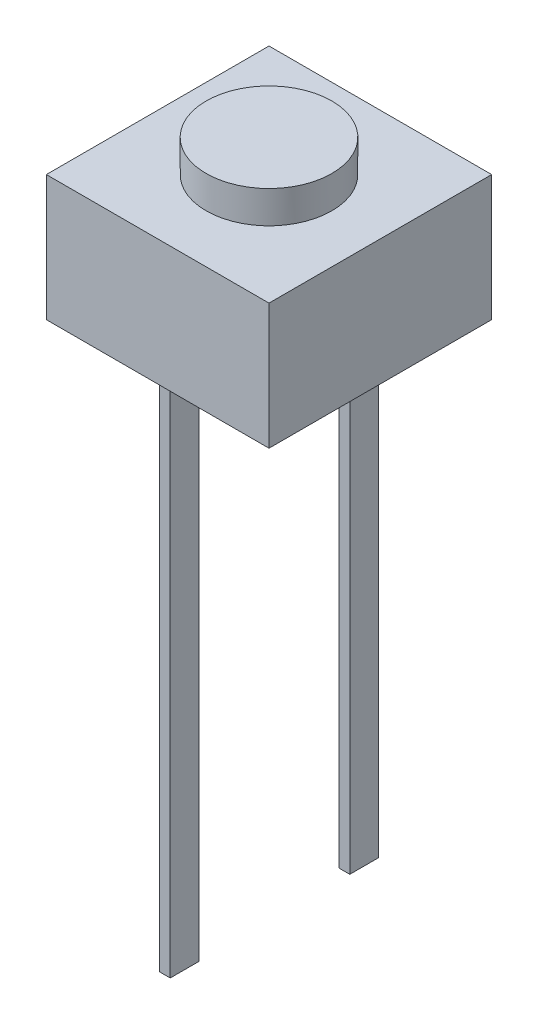
ISO-10303-21;
HEADER;
FILE_DESCRIPTION(('STEP AP214'),'2;1');
FILE_NAME('part.step','',(''),(''),'','','');
FILE_SCHEMA(('AUTOMOTIVE_DESIGN { 1 0 10303 214 1 1 1 1 }'));
ENDSEC;
DATA;
#1=APPLICATION_CONTEXT('core data for automotive mechanical design processes');
#2=APPLICATION_PROTOCOL_DEFINITION('international standard','automotive_design',2000,#1);
#3=PRODUCT_CONTEXT('',#1,'mechanical');
#4=PRODUCT('Part','Part','',(#3));
#5=PRODUCT_RELATED_PRODUCT_CATEGORY('part','',(#4));
#6=PRODUCT_DEFINITION_FORMATION('','',#4);
#7=PRODUCT_DEFINITION_CONTEXT('part definition',#1,'design');
#8=PRODUCT_DEFINITION('design','',#6,#7);
#9=PRODUCT_DEFINITION_SHAPE('','',#8);
#10=(LENGTH_UNIT() NAMED_UNIT(*) SI_UNIT(.MILLI.,.METRE.));
#11=(NAMED_UNIT(*) PLANE_ANGLE_UNIT() SI_UNIT($,.RADIAN.));
#12=(NAMED_UNIT(*) SI_UNIT($,.STERADIAN.) SOLID_ANGLE_UNIT());
#13=UNCERTAINTY_MEASURE_WITH_UNIT(LENGTH_MEASURE(1.E-05),#10,'distance_accuracy_value','');
#14=(GEOMETRIC_REPRESENTATION_CONTEXT(3) GLOBAL_UNCERTAINTY_ASSIGNED_CONTEXT((#13)) GLOBAL_UNIT_ASSIGNED_CONTEXT((#10,
#11,#12)) REPRESENTATION_CONTEXT('',''));
#15=CARTESIAN_POINT('',(0.,0.,0.));
#16=DIRECTION('',(0.,0.,1.));
#17=DIRECTION('',(1.,0.,0.));
#18=AXIS2_PLACEMENT_3D('',#15,#16,#17);
#19=CARTESIAN_POINT('',(0.,0.,0.));
#20=DIRECTION('',(0.,-1.,0.));
#21=DIRECTION('',(0.,0.,-1.));
#22=AXIS2_PLACEMENT_3D('',#19,#20,#21);
#23=PLANE('',#22);
#24=DIRECTION('',(0.,0.,-1.));
#25=VECTOR('',#24,1.);
#26=CARTESIAN_POINT('',(3.1,0.,3.1));
#27=LINE('',#26,#25);
#28=CARTESIAN_POINT('',(3.1,0.,3.1));
#29=VERTEX_POINT('',#28);
#30=CARTESIAN_POINT('',(3.1,0.,-3.1));
#31=VERTEX_POINT('',#30);
#32=EDGE_CURVE('E209',#29,#31,#27,.T.);
#33=ORIENTED_EDGE('',*,*,#32,.F.);
#34=DIRECTION('',(1.,0.,0.));
#35=VECTOR('',#34,1.);
#36=CARTESIAN_POINT('',(-3.1,0.,3.1));
#37=LINE('',#36,#35);
#38=CARTESIAN_POINT('',(-3.1,0.,3.1));
#39=VERTEX_POINT('',#38);
#40=EDGE_CURVE('E215',#39,#29,#37,.T.);
#41=ORIENTED_EDGE('',*,*,#40,.F.);
#42=DIRECTION('',(0.,0.,1.));
#43=VECTOR('',#42,1.);
#44=CARTESIAN_POINT('',(-3.1,0.,3.1));
#45=LINE('',#44,#43);
#46=CARTESIAN_POINT('',(-3.1,0.,-3.1));
#47=VERTEX_POINT('',#46);
#48=EDGE_CURVE('E231',#47,#39,#45,.T.);
#49=ORIENTED_EDGE('',*,*,#48,.F.);
#50=DIRECTION('',(-1.,0.,0.));
#51=VECTOR('',#50,1.);
#52=CARTESIAN_POINT('',(-3.1,0.,-3.1));
#53=LINE('',#52,#51);
#54=EDGE_CURVE('E228',#31,#47,#53,.T.);
#55=ORIENTED_EDGE('',*,*,#54,.F.);
#56=EDGE_LOOP('',(#33,#41,#49,#55));
#57=FACE_BOUND('',#56,.T.);
#58=DIRECTION('',(0.,0.,1.));
#59=VECTOR('',#58,1.);
#60=CARTESIAN_POINT('',(0.15,0.,2.1));
#61=LINE('',#60,#59);
#62=CARTESIAN_POINT('',(0.15,0.,2.1));
#63=VERTEX_POINT('',#62);
#64=CARTESIAN_POINT('',(0.15,0.,2.9));
#65=VERTEX_POINT('',#64);
#66=EDGE_CURVE('E166',#63,#65,#61,.T.);
#67=ORIENTED_EDGE('',*,*,#66,.F.);
#68=DIRECTION('',(1.,0.,0.));
#69=VECTOR('',#68,1.);
#70=CARTESIAN_POINT('',(-0.15,0.,2.1));
#71=LINE('',#70,#69);
#72=CARTESIAN_POINT('',(-0.15,0.,2.1));
#73=VERTEX_POINT('',#72);
#74=EDGE_CURVE('E161',#73,#63,#71,.T.);
#75=ORIENTED_EDGE('',*,*,#74,.F.);
#76=DIRECTION('',(0.,0.,-1.));
#77=VECTOR('',#76,1.);
#78=CARTESIAN_POINT('',(-0.15,0.,2.1));
#79=LINE('',#78,#77);
#80=CARTESIAN_POINT('',(-0.15,0.,2.9));
#81=VERTEX_POINT('',#80);
#82=EDGE_CURVE('E176',#81,#73,#79,.T.);
#83=ORIENTED_EDGE('',*,*,#82,.F.);
#84=DIRECTION('',(-1.,0.,0.));
#85=VECTOR('',#84,1.);
#86=CARTESIAN_POINT('',(-0.15,0.,2.9));
#87=LINE('',#86,#85);
#88=EDGE_CURVE('E188',#65,#81,#87,.T.);
#89=ORIENTED_EDGE('',*,*,#88,.F.);
#90=EDGE_LOOP('',(#67,#75,#83,#89));
#91=FACE_BOUND('',#90,.T.);
#92=DIRECTION('',(0.,0.,-1.));
#93=VECTOR('',#92,1.);
#94=CARTESIAN_POINT('',(-0.15,0.,-2.1));
#95=LINE('',#94,#93);
#96=CARTESIAN_POINT('',(-0.15,0.,-2.1));
#97=VERTEX_POINT('',#96);
#98=CARTESIAN_POINT('',(-0.15,0.,-2.9));
#99=VERTEX_POINT('',#98);
#100=EDGE_CURVE('E429',#97,#99,#95,.T.);
#101=ORIENTED_EDGE('',*,*,#100,.F.);
#102=DIRECTION('',(-1.,0.,0.));
#103=VECTOR('',#102,1.);
#104=CARTESIAN_POINT('',(-0.15,0.,-2.1));
#105=LINE('',#104,#103);
#106=CARTESIAN_POINT('',(0.15,0.,-2.1));
#107=VERTEX_POINT('',#106);
#108=EDGE_CURVE('E158',#107,#97,#105,.T.);
#109=ORIENTED_EDGE('',*,*,#108,.F.);
#110=DIRECTION('',(0.,0.,1.));
#111=VECTOR('',#110,1.);
#112=CARTESIAN_POINT('',(0.15,0.,-2.1));
#113=LINE('',#112,#111);
#114=CARTESIAN_POINT('',(0.15,0.,-2.9));
#115=VERTEX_POINT('',#114);
#116=EDGE_CURVE('E154',#115,#107,#113,.T.);
#117=ORIENTED_EDGE('',*,*,#116,.F.);
#118=DIRECTION('',(1.,0.,0.));
#119=VECTOR('',#118,1.);
#120=CARTESIAN_POINT('',(-0.15,0.,-2.9));
#121=LINE('',#120,#119);
#122=EDGE_CURVE('E425',#99,#115,#121,.T.);
#123=ORIENTED_EDGE('',*,*,#122,.F.);
#124=EDGE_LOOP('',(#101,#109,#117,#123));
#125=FACE_BOUND('',#124,.T.);
#126=ADVANCED_FACE('F41',(#57,#91,#125),#23,.T.);
#127=CARTESIAN_POINT('',(3.1,3.5,3.1));
#128=DIRECTION('',(-1.,0.,0.));
#129=DIRECTION('',(0.,0.,1.));
#130=AXIS2_PLACEMENT_3D('',#127,#128,#129);
#131=PLANE('',#130);
#132=ORIENTED_EDGE('',*,*,#32,.T.);
#133=DIRECTION('',(0.,-1.,0.));
#134=VECTOR('',#133,1.);
#135=CARTESIAN_POINT('',(3.1,3.5,-3.1));
#136=LINE('',#135,#134);
#137=CARTESIAN_POINT('',(3.1,3.5,-3.1));
#138=VERTEX_POINT('',#137);
#139=EDGE_CURVE('E45',#138,#31,#136,.T.);
#140=ORIENTED_EDGE('',*,*,#139,.F.);
#141=DIRECTION('',(0.,0.,-1.));
#142=VECTOR('',#141,1.);
#143=CARTESIAN_POINT('',(3.1,3.5,3.1));
#144=LINE('',#143,#142);
#145=CARTESIAN_POINT('',(3.1,3.5,3.1));
#146=VERTEX_POINT('',#145);
#147=EDGE_CURVE('E210',#146,#138,#144,.T.);
#148=ORIENTED_EDGE('',*,*,#147,.F.);
#149=DIRECTION('',(0.,-1.,0.));
#150=VECTOR('',#149,1.);
#151=CARTESIAN_POINT('',(3.1,3.5,3.1));
#152=LINE('',#151,#150);
#153=EDGE_CURVE('E224',#146,#29,#152,.T.);
#154=ORIENTED_EDGE('',*,*,#153,.T.);
#155=EDGE_LOOP('',(#132,#140,#148,#154));
#156=FACE_BOUND('',#155,.T.);
#157=ADVANCED_FACE('F43',(#156),#131,.F.);
#158=CARTESIAN_POINT('',(-3.1,3.5,-3.1));
#159=DIRECTION('',(0.,0.,1.));
#160=DIRECTION('',(1.,0.,0.));
#161=AXIS2_PLACEMENT_3D('',#158,#159,#160);
#162=PLANE('',#161);
#163=ORIENTED_EDGE('',*,*,#54,.T.);
#164=DIRECTION('',(0.,-1.,0.));
#165=VECTOR('',#164,1.);
#166=CARTESIAN_POINT('',(-3.1,3.5,-3.1));
#167=LINE('',#166,#165);
#168=CARTESIAN_POINT('',(-3.1,3.5,-3.1));
#169=VERTEX_POINT('',#168);
#170=EDGE_CURVE('E242',#169,#47,#167,.T.);
#171=ORIENTED_EDGE('',*,*,#170,.F.);
#172=DIRECTION('',(-1.,0.,0.));
#173=VECTOR('',#172,1.);
#174=CARTESIAN_POINT('',(-3.1,3.5,-3.1));
#175=LINE('',#174,#173);
#176=EDGE_CURVE('E214',#138,#169,#175,.T.);
#177=ORIENTED_EDGE('',*,*,#176,.F.);
#178=ORIENTED_EDGE('',*,*,#139,.T.);
#179=EDGE_LOOP('',(#163,#171,#177,#178));
#180=FACE_BOUND('',#179,.T.);
#181=ADVANCED_FACE('F253',(#180),#162,.F.);
#182=CARTESIAN_POINT('',(-3.1,3.5,3.1));
#183=DIRECTION('',(1.,0.,0.));
#184=DIRECTION('',(0.,0.,-1.));
#185=AXIS2_PLACEMENT_3D('',#182,#183,#184);
#186=PLANE('',#185);
#187=ORIENTED_EDGE('',*,*,#48,.T.);
#188=DIRECTION('',(0.,-1.,0.));
#189=VECTOR('',#188,1.);
#190=CARTESIAN_POINT('',(-3.1,3.5,3.1));
#191=LINE('',#190,#189);
#192=CARTESIAN_POINT('',(-3.1,3.5,3.1));
#193=VERTEX_POINT('',#192);
#194=EDGE_CURVE('E239',#193,#39,#191,.T.);
#195=ORIENTED_EDGE('',*,*,#194,.F.);
#196=DIRECTION('',(0.,0.,1.));
#197=VECTOR('',#196,1.);
#198=CARTESIAN_POINT('',(-3.1,3.5,3.1));
#199=LINE('',#198,#197);
#200=EDGE_CURVE('E218',#169,#193,#199,.T.);
#201=ORIENTED_EDGE('',*,*,#200,.F.);
#202=ORIENTED_EDGE('',*,*,#170,.T.);
#203=EDGE_LOOP('',(#187,#195,#201,#202));
#204=FACE_BOUND('',#203,.T.);
#205=ADVANCED_FACE('F262',(#204),#186,.F.);
#206=CARTESIAN_POINT('',(-3.1,3.5,3.1));
#207=DIRECTION('',(0.,0.,-1.));
#208=DIRECTION('',(-1.,0.,0.));
#209=AXIS2_PLACEMENT_3D('',#206,#207,#208);
#210=PLANE('',#209);
#211=ORIENTED_EDGE('',*,*,#40,.T.);
#212=ORIENTED_EDGE('',*,*,#153,.F.);
#213=DIRECTION('',(1.,0.,0.));
#214=VECTOR('',#213,1.);
#215=CARTESIAN_POINT('',(-3.1,3.5,3.1));
#216=LINE('',#215,#214);
#217=EDGE_CURVE('E221',#193,#146,#216,.T.);
#218=ORIENTED_EDGE('',*,*,#217,.F.);
#219=ORIENTED_EDGE('',*,*,#194,.T.);
#220=EDGE_LOOP('',(#211,#212,#218,#219));
#221=FACE_BOUND('',#220,.T.);
#222=ADVANCED_FACE('F265',(#221),#210,.F.);
#223=CARTESIAN_POINT('',(0.,3.5,0.));
#224=DIRECTION('',(0.,-1.,0.));
#225=DIRECTION('',(0.,0.,-1.));
#226=AXIS2_PLACEMENT_3D('',#223,#224,#225);
#227=PLANE('',#226);
#228=CARTESIAN_POINT('',(0.,3.5,0.));
#229=DIRECTION('',(0.,1.,0.));
#230=DIRECTION('',(0.,0.,1.));
#231=AXIS2_PLACEMENT_3D('',#228,#229,#230);
#232=CIRCLE('',#231,1.75);
#233=CARTESIAN_POINT('',(0.,3.5,1.75));
#234=VERTEX_POINT('',#233);
#235=EDGE_CURVE('E12',#234,#234,#232,.T.);
#236=ORIENTED_EDGE('',*,*,#235,.F.);
#237=EDGE_LOOP('',(#236));
#238=FACE_BOUND('',#237,.T.);
#239=ORIENTED_EDGE('',*,*,#147,.T.);
#240=ORIENTED_EDGE('',*,*,#176,.T.);
#241=ORIENTED_EDGE('',*,*,#200,.T.);
#242=ORIENTED_EDGE('',*,*,#217,.T.);
#243=EDGE_LOOP('',(#239,#240,#241,#242));
#244=FACE_BOUND('',#243,.T.);
#245=ADVANCED_FACE('F267',(#238,#244),#227,.F.);
#246=CARTESIAN_POINT('',(0.,13.7497474683058,0.));
#247=DIRECTION('',(0.,-1.,0.));
#248=DIRECTION('',(0.,0.,-1.));
#249=AXIS2_PLACEMENT_3D('',#246,#247,#248);
#250=CYLINDRICAL_SURFACE('',#249,1.75);
#251=CARTESIAN_POINT('',(0.,4.4,0.));
#252=DIRECTION('',(0.,-1.,0.));
#253=DIRECTION('',(0.,0.,-1.));
#254=AXIS2_PLACEMENT_3D('',#251,#252,#253);
#255=CIRCLE('',#254,1.75);
#256=CARTESIAN_POINT('',(0.,4.4,-1.75));
#257=VERTEX_POINT('',#256);
#258=EDGE_CURVE('E204',#257,#257,#255,.T.);
#259=ORIENTED_EDGE('',*,*,#258,.T.);
#260=EDGE_LOOP('',(#259));
#261=FACE_BOUND('',#260,.T.);
#262=ORIENTED_EDGE('',*,*,#235,.T.);
#263=EDGE_LOOP('',(#262));
#264=FACE_BOUND('',#263,.T.);
#265=ADVANCED_FACE('F269',(#261,#264),#250,.T.);
#266=CARTESIAN_POINT('',(0.,4.4,0.));
#267=DIRECTION('',(0.,-1.,0.));
#268=DIRECTION('',(0.,0.,-1.));
#269=AXIS2_PLACEMENT_3D('',#266,#267,#268);
#270=PLANE('',#269);
#271=ORIENTED_EDGE('',*,*,#258,.F.);
#272=EDGE_LOOP('',(#271));
#273=FACE_BOUND('',#272,.T.);
#274=ADVANCED_FACE('F276',(#273),#270,.F.);
#275=CARTESIAN_POINT('',(-0.15,-14.35,2.1));
#276=DIRECTION('',(0.,0.,1.));
#277=DIRECTION('',(1.,0.,0.));
#278=AXIS2_PLACEMENT_3D('',#275,#276,#277);
#279=PLANE('',#278);
#280=ORIENTED_EDGE('',*,*,#74,.T.);
#281=DIRECTION('',(0.,1.,0.));
#282=VECTOR('',#281,1.);
#283=CARTESIAN_POINT('',(0.15,-14.35,2.1));
#284=LINE('',#283,#282);
#285=CARTESIAN_POINT('',(0.15,-14.35,2.1));
#286=VERTEX_POINT('',#285);
#287=EDGE_CURVE('E202',#286,#63,#284,.T.);
#288=ORIENTED_EDGE('',*,*,#287,.F.);
#289=DIRECTION('',(1.,0.,0.));
#290=VECTOR('',#289,1.);
#291=CARTESIAN_POINT('',(-0.15,-14.35,2.1));
#292=LINE('',#291,#290);
#293=CARTESIAN_POINT('',(-0.15,-14.35,2.1));
#294=VERTEX_POINT('',#293);
#295=EDGE_CURVE('E171',#294,#286,#292,.T.);
#296=ORIENTED_EDGE('',*,*,#295,.F.);
#297=DIRECTION('',(0.,1.,0.));
#298=VECTOR('',#297,1.);
#299=CARTESIAN_POINT('',(-0.15,-14.35,2.1));
#300=LINE('',#299,#298);
#301=EDGE_CURVE('E184',#294,#73,#300,.T.);
#302=ORIENTED_EDGE('',*,*,#301,.T.);
#303=EDGE_LOOP('',(#280,#288,#296,#302));
#304=FACE_BOUND('',#303,.T.);
#305=ADVANCED_FACE('F319',(#304),#279,.F.);
#306=CARTESIAN_POINT('',(0.15,-14.35,2.1));
#307=DIRECTION('',(-1.,0.,0.));
#308=DIRECTION('',(0.,0.,1.));
#309=AXIS2_PLACEMENT_3D('',#306,#307,#308);
#310=PLANE('',#309);
#311=ORIENTED_EDGE('',*,*,#66,.T.);
#312=DIRECTION('',(0.,1.,0.));
#313=VECTOR('',#312,1.);
#314=CARTESIAN_POINT('',(0.15,-14.35,2.9));
#315=LINE('',#314,#313);
#316=CARTESIAN_POINT('',(0.15,-14.35,2.9));
#317=VERTEX_POINT('',#316);
#318=EDGE_CURVE('E198',#317,#65,#315,.T.);
#319=ORIENTED_EDGE('',*,*,#318,.F.);
#320=DIRECTION('',(0.,0.,1.));
#321=VECTOR('',#320,1.);
#322=CARTESIAN_POINT('',(0.15,-14.35,2.1));
#323=LINE('',#322,#321);
#324=EDGE_CURVE('E175',#286,#317,#323,.T.);
#325=ORIENTED_EDGE('',*,*,#324,.F.);
#326=ORIENTED_EDGE('',*,*,#287,.T.);
#327=EDGE_LOOP('',(#311,#319,#325,#326));
#328=FACE_BOUND('',#327,.T.);
#329=ADVANCED_FACE('F334',(#328),#310,.F.);
#330=CARTESIAN_POINT('',(-0.15,-14.35,2.9));
#331=DIRECTION('',(0.,0.,-1.));
#332=DIRECTION('',(-1.,0.,0.));
#333=AXIS2_PLACEMENT_3D('',#330,#331,#332);
#334=PLANE('',#333);
#335=ORIENTED_EDGE('',*,*,#88,.T.);
#336=DIRECTION('',(0.,1.,0.));
#337=VECTOR('',#336,1.);
#338=CARTESIAN_POINT('',(-0.15,-14.35,2.9));
#339=LINE('',#338,#337);
#340=CARTESIAN_POINT('',(-0.15,-14.35,2.9));
#341=VERTEX_POINT('',#340);
#342=EDGE_CURVE('E66',#341,#81,#339,.T.);
#343=ORIENTED_EDGE('',*,*,#342,.F.);
#344=DIRECTION('',(-1.,0.,0.));
#345=VECTOR('',#344,1.);
#346=CARTESIAN_POINT('',(-0.15,-14.35,2.9));
#347=LINE('',#346,#345);
#348=EDGE_CURVE('E179',#317,#341,#347,.T.);
#349=ORIENTED_EDGE('',*,*,#348,.F.);
#350=ORIENTED_EDGE('',*,*,#318,.T.);
#351=EDGE_LOOP('',(#335,#343,#349,#350));
#352=FACE_BOUND('',#351,.T.);
#353=ADVANCED_FACE('F344',(#352),#334,.F.);
#354=CARTESIAN_POINT('',(-0.15,-14.35,2.1));
#355=DIRECTION('',(1.,0.,0.));
#356=DIRECTION('',(0.,0.,-1.));
#357=AXIS2_PLACEMENT_3D('',#354,#355,#356);
#358=PLANE('',#357);
#359=ORIENTED_EDGE('',*,*,#82,.T.);
#360=ORIENTED_EDGE('',*,*,#301,.F.);
#361=DIRECTION('',(0.,0.,-1.));
#362=VECTOR('',#361,1.);
#363=CARTESIAN_POINT('',(-0.15,-14.35,2.1));
#364=LINE('',#363,#362);
#365=EDGE_CURVE('E182',#341,#294,#364,.T.);
#366=ORIENTED_EDGE('',*,*,#365,.F.);
#367=ORIENTED_EDGE('',*,*,#342,.T.);
#368=EDGE_LOOP('',(#359,#360,#366,#367));
#369=FACE_BOUND('',#368,.T.);
#370=ADVANCED_FACE('F354',(#369),#358,.F.);
#371=CARTESIAN_POINT('',(0.,-14.35,0.));
#372=DIRECTION('',(0.,-1.,0.));
#373=DIRECTION('',(0.,0.,-1.));
#374=AXIS2_PLACEMENT_3D('',#371,#372,#373);
#375=PLANE('',#374);
#376=ORIENTED_EDGE('',*,*,#295,.T.);
#377=ORIENTED_EDGE('',*,*,#324,.T.);
#378=ORIENTED_EDGE('',*,*,#348,.T.);
#379=ORIENTED_EDGE('',*,*,#365,.T.);
#380=EDGE_LOOP('',(#376,#377,#378,#379));
#381=FACE_BOUND('',#380,.T.);
#382=ADVANCED_FACE('F364',(#381),#375,.T.);
#383=CARTESIAN_POINT('',(-0.15,-14.35,-2.1));
#384=DIRECTION('',(0.,0.,-1.));
#385=DIRECTION('',(-1.,0.,0.));
#386=AXIS2_PLACEMENT_3D('',#383,#384,#385);
#387=PLANE('',#386);
#388=ORIENTED_EDGE('',*,*,#108,.T.);
#389=DIRECTION('',(0.,1.,0.));
#390=VECTOR('',#389,1.);
#391=CARTESIAN_POINT('',(-0.15,-14.35,-2.1));
#392=LINE('',#391,#390);
#393=CARTESIAN_POINT('',(-0.15,-14.35,-2.1));
#394=VERTEX_POINT('',#393);
#395=EDGE_CURVE('E137',#394,#97,#392,.T.);
#396=ORIENTED_EDGE('',*,*,#395,.F.);
#397=DIRECTION('',(-1.,0.,0.));
#398=VECTOR('',#397,1.);
#399=CARTESIAN_POINT('',(-0.15,-14.35,-2.1));
#400=LINE('',#399,#398);
#401=CARTESIAN_POINT('',(0.15,-14.35,-2.1));
#402=VERTEX_POINT('',#401);
#403=EDGE_CURVE('E145',#402,#394,#400,.T.);
#404=ORIENTED_EDGE('',*,*,#403,.F.);
#405=DIRECTION('',(0.,1.,0.));
#406=VECTOR('',#405,1.);
#407=CARTESIAN_POINT('',(0.15,-14.35,-2.1));
#408=LINE('',#407,#406);
#409=EDGE_CURVE('E421',#402,#107,#408,.T.);
#410=ORIENTED_EDGE('',*,*,#409,.T.);
#411=EDGE_LOOP('',(#388,#396,#404,#410));
#412=FACE_BOUND('',#411,.T.);
#413=ADVANCED_FACE('F156',(#412),#387,.F.);
#414=CARTESIAN_POINT('',(-0.15,-14.35,-2.1));
#415=DIRECTION('',(1.,0.,0.));
#416=DIRECTION('',(0.,0.,-1.));
#417=AXIS2_PLACEMENT_3D('',#414,#415,#416);
#418=PLANE('',#417);
#419=ORIENTED_EDGE('',*,*,#100,.T.);
#420=DIRECTION('',(0.,1.,0.));
#421=VECTOR('',#420,1.);
#422=CARTESIAN_POINT('',(-0.15,-14.35,-2.9));
#423=LINE('',#422,#421);
#424=CARTESIAN_POINT('',(-0.15,-14.35,-2.9));
#425=VERTEX_POINT('',#424);
#426=EDGE_CURVE('E140',#425,#99,#423,.T.);
#427=ORIENTED_EDGE('',*,*,#426,.F.);
#428=DIRECTION('',(0.,0.,-1.));
#429=VECTOR('',#428,1.);
#430=CARTESIAN_POINT('',(-0.15,-14.35,-2.1));
#431=LINE('',#430,#429);
#432=EDGE_CURVE('E133',#394,#425,#431,.T.);
#433=ORIENTED_EDGE('',*,*,#432,.F.);
#434=ORIENTED_EDGE('',*,*,#395,.T.);
#435=EDGE_LOOP('',(#419,#427,#433,#434));
#436=FACE_BOUND('',#435,.T.);
#437=ADVANCED_FACE('F135',(#436),#418,.F.);
#438=CARTESIAN_POINT('',(-0.15,-14.35,-2.9));
#439=DIRECTION('',(0.,0.,1.));
#440=DIRECTION('',(1.,0.,0.));
#441=AXIS2_PLACEMENT_3D('',#438,#439,#440);
#442=PLANE('',#441);
#443=ORIENTED_EDGE('',*,*,#122,.T.);
#444=DIRECTION('',(0.,1.,0.));
#445=VECTOR('',#444,1.);
#446=CARTESIAN_POINT('',(0.15,-14.35,-2.9));
#447=LINE('',#446,#445);
#448=CARTESIAN_POINT('',(0.15,-14.35,-2.9));
#449=VERTEX_POINT('',#448);
#450=EDGE_CURVE('E58',#449,#115,#447,.T.);
#451=ORIENTED_EDGE('',*,*,#450,.F.);
#452=DIRECTION('',(1.,0.,0.));
#453=VECTOR('',#452,1.);
#454=CARTESIAN_POINT('',(-0.15,-14.35,-2.9));
#455=LINE('',#454,#453);
#456=EDGE_CURVE('E144',#425,#449,#455,.T.);
#457=ORIENTED_EDGE('',*,*,#456,.F.);
#458=ORIENTED_EDGE('',*,*,#426,.T.);
#459=EDGE_LOOP('',(#443,#451,#457,#458));
#460=FACE_BOUND('',#459,.T.);
#461=ADVANCED_FACE('F390',(#460),#442,.F.);
#462=CARTESIAN_POINT('',(0.15,-14.35,-2.1));
#463=DIRECTION('',(-1.,0.,0.));
#464=DIRECTION('',(0.,0.,1.));
#465=AXIS2_PLACEMENT_3D('',#462,#463,#464);
#466=PLANE('',#465);
#467=ORIENTED_EDGE('',*,*,#116,.T.);
#468=ORIENTED_EDGE('',*,*,#409,.F.);
#469=DIRECTION('',(0.,0.,1.));
#470=VECTOR('',#469,1.);
#471=CARTESIAN_POINT('',(0.15,-14.35,-2.1));
#472=LINE('',#471,#470);
#473=EDGE_CURVE('E149',#449,#402,#472,.T.);
#474=ORIENTED_EDGE('',*,*,#473,.F.);
#475=ORIENTED_EDGE('',*,*,#450,.T.);
#476=EDGE_LOOP('',(#467,#468,#474,#475));
#477=FACE_BOUND('',#476,.T.);
#478=ADVANCED_FACE('F399',(#477),#466,.F.);
#479=CARTESIAN_POINT('',(0.,-14.35,0.));
#480=DIRECTION('',(0.,1.,0.));
#481=DIRECTION('',(0.,0.,1.));
#482=AXIS2_PLACEMENT_3D('',#479,#480,#481);
#483=PLANE('',#482);
#484=ORIENTED_EDGE('',*,*,#403,.T.);
#485=ORIENTED_EDGE('',*,*,#432,.T.);
#486=ORIENTED_EDGE('',*,*,#456,.T.);
#487=ORIENTED_EDGE('',*,*,#473,.T.);
#488=EDGE_LOOP('',(#484,#485,#486,#487));
#489=FACE_BOUND('',#488,.T.);
#490=ADVANCED_FACE('F148',(#489),#483,.F.);
#491=CLOSED_SHELL('',(#126,#157,#181,#205,#222,#245,#265,#274,#305,#329,#353,#370,#382,#413,
#437,#461,#478,#490));
#492=MANIFOLD_SOLID_BREP('B2',#491);
#493=ADVANCED_BREP_SHAPE_REPRESENTATION('',(#18,#492),#14);
#494=SHAPE_DEFINITION_REPRESENTATION(#9,#493);
ENDSEC;
END-ISO-10303-21;
